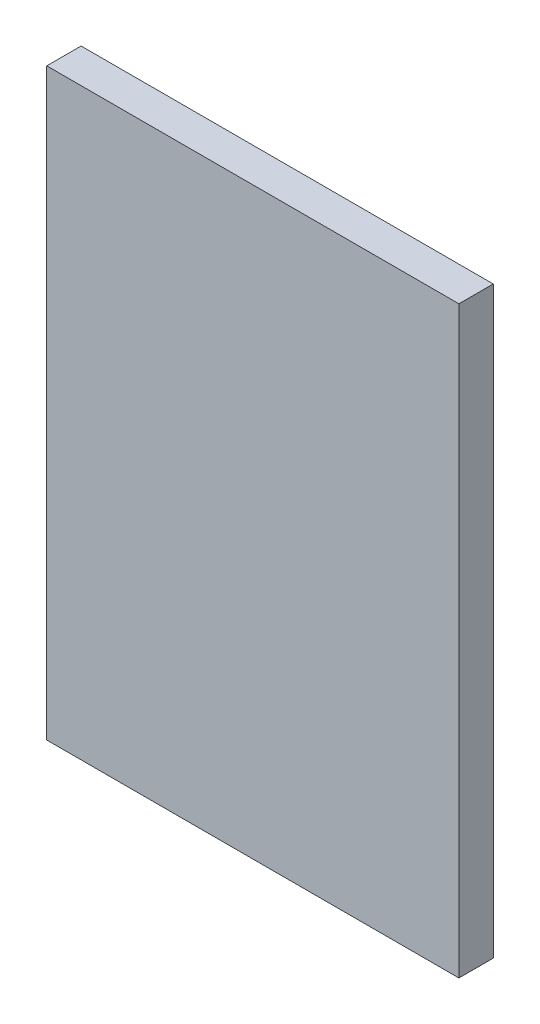
ISO-10303-21;
HEADER;
FILE_DESCRIPTION(('STEP AP214'),'2;1');
FILE_NAME('part.step','',(''),(''),'','','');
FILE_SCHEMA(('AUTOMOTIVE_DESIGN { 1 0 10303 214 1 1 1 1 }'));
ENDSEC;
DATA;
#1=APPLICATION_CONTEXT('core data for automotive mechanical design processes');
#2=APPLICATION_PROTOCOL_DEFINITION('international standard','automotive_design',2000,#1);
#3=PRODUCT_CONTEXT('',#1,'mechanical');
#4=PRODUCT('Part','Part','',(#3));
#5=PRODUCT_RELATED_PRODUCT_CATEGORY('part','',(#4));
#6=PRODUCT_DEFINITION_FORMATION('','',#4);
#7=PRODUCT_DEFINITION_CONTEXT('part definition',#1,'design');
#8=PRODUCT_DEFINITION('design','',#6,#7);
#9=PRODUCT_DEFINITION_SHAPE('','',#8);
#10=(LENGTH_UNIT() NAMED_UNIT(*) SI_UNIT(.MILLI.,.METRE.));
#11=(NAMED_UNIT(*) PLANE_ANGLE_UNIT() SI_UNIT($,.RADIAN.));
#12=(NAMED_UNIT(*) SI_UNIT($,.STERADIAN.) SOLID_ANGLE_UNIT());
#13=UNCERTAINTY_MEASURE_WITH_UNIT(LENGTH_MEASURE(1.E-05),#10,'distance_accuracy_value','');
#14=(GEOMETRIC_REPRESENTATION_CONTEXT(3) GLOBAL_UNCERTAINTY_ASSIGNED_CONTEXT((#13)) GLOBAL_UNIT_ASSIGNED_CONTEXT((#10,
#11,#12)) REPRESENTATION_CONTEXT('',''));
#15=CARTESIAN_POINT('',(0.,0.,0.));
#16=DIRECTION('',(0.,0.,1.));
#17=DIRECTION('',(1.,0.,0.));
#18=AXIS2_PLACEMENT_3D('',#15,#16,#17);
#19=CARTESIAN_POINT('',(152.4,-215.9,25.4));
#20=DIRECTION('',(-1.,0.,0.));
#21=DIRECTION('',(0.,0.,1.));
#22=AXIS2_PLACEMENT_3D('',#19,#20,#21);
#23=PLANE('',#22);
#24=DIRECTION('',(0.,1.,0.));
#25=VECTOR('',#24,1.);
#26=CARTESIAN_POINT('',(152.4,-215.9,0.));
#27=LINE('',#26,#25);
#28=CARTESIAN_POINT('',(152.4,-215.9,0.));
#29=VERTEX_POINT('',#28);
#30=CARTESIAN_POINT('',(152.4,215.9,0.));
#31=VERTEX_POINT('',#30);
#32=EDGE_CURVE('E96',#29,#31,#27,.T.);
#33=ORIENTED_EDGE('',*,*,#32,.T.);
#34=DIRECTION('',(0.,0.,-1.));
#35=VECTOR('',#34,1.);
#36=CARTESIAN_POINT('',(152.4,215.9,25.4));
#37=LINE('',#36,#35);
#38=CARTESIAN_POINT('',(152.4,215.9,25.4));
#39=VERTEX_POINT('',#38);
#40=EDGE_CURVE('E11',#39,#31,#37,.T.);
#41=ORIENTED_EDGE('',*,*,#40,.F.);
#42=DIRECTION('',(0.,1.,0.));
#43=VECTOR('',#42,1.);
#44=CARTESIAN_POINT('',(152.4,-215.9,25.4));
#45=LINE('',#44,#43);
#46=CARTESIAN_POINT('',(152.4,-215.9,25.4));
#47=VERTEX_POINT('',#46);
#48=EDGE_CURVE('E84',#47,#39,#45,.T.);
#49=ORIENTED_EDGE('',*,*,#48,.F.);
#50=DIRECTION('',(0.,0.,-1.));
#51=VECTOR('',#50,1.);
#52=CARTESIAN_POINT('',(152.4,-215.9,25.4));
#53=LINE('',#52,#51);
#54=EDGE_CURVE('E92',#47,#29,#53,.T.);
#55=ORIENTED_EDGE('',*,*,#54,.T.);
#56=EDGE_LOOP('',(#33,#41,#49,#55));
#57=FACE_BOUND('',#56,.T.);
#58=ADVANCED_FACE('F33',(#57),#23,.F.);
#59=CARTESIAN_POINT('',(-152.4,215.9,25.4));
#60=DIRECTION('',(0.,-1.,0.));
#61=DIRECTION('',(0.,0.,-1.));
#62=AXIS2_PLACEMENT_3D('',#59,#60,#61);
#63=PLANE('',#62);
#64=DIRECTION('',(-1.,0.,0.));
#65=VECTOR('',#64,1.);
#66=CARTESIAN_POINT('',(-152.4,215.9,0.));
#67=LINE('',#66,#65);
#68=CARTESIAN_POINT('',(-152.4,215.9,0.));
#69=VERTEX_POINT('',#68);
#70=EDGE_CURVE('E88',#31,#69,#67,.T.);
#71=ORIENTED_EDGE('',*,*,#70,.T.);
#72=DIRECTION('',(0.,0.,-1.));
#73=VECTOR('',#72,1.);
#74=CARTESIAN_POINT('',(-152.4,215.9,25.4));
#75=LINE('',#74,#73);
#76=CARTESIAN_POINT('',(-152.4,215.9,25.4));
#77=VERTEX_POINT('',#76);
#78=EDGE_CURVE('E41',#77,#69,#75,.T.);
#79=ORIENTED_EDGE('',*,*,#78,.F.);
#80=DIRECTION('',(-1.,0.,0.));
#81=VECTOR('',#80,1.);
#82=CARTESIAN_POINT('',(-152.4,215.9,25.4));
#83=LINE('',#82,#81);
#84=EDGE_CURVE('E79',#39,#77,#83,.T.);
#85=ORIENTED_EDGE('',*,*,#84,.F.);
#86=ORIENTED_EDGE('',*,*,#40,.T.);
#87=EDGE_LOOP('',(#71,#79,#85,#86));
#88=FACE_BOUND('',#87,.T.);
#89=ADVANCED_FACE('F87',(#88),#63,.F.);
#90=CARTESIAN_POINT('',(-152.4,-215.9,25.4));
#91=DIRECTION('',(1.,0.,0.));
#92=DIRECTION('',(0.,0.,-1.));
#93=AXIS2_PLACEMENT_3D('',#90,#91,#92);
#94=PLANE('',#93);
#95=DIRECTION('',(0.,-1.,0.));
#96=VECTOR('',#95,1.);
#97=CARTESIAN_POINT('',(-152.4,-215.9,0.));
#98=LINE('',#97,#96);
#99=CARTESIAN_POINT('',(-152.4,-215.9,0.));
#100=VERTEX_POINT('',#99);
#101=EDGE_CURVE('E66',#69,#100,#98,.T.);
#102=ORIENTED_EDGE('',*,*,#101,.T.);
#103=DIRECTION('',(0.,0.,-1.));
#104=VECTOR('',#103,1.);
#105=CARTESIAN_POINT('',(-152.4,-215.9,25.4));
#106=LINE('',#105,#104);
#107=CARTESIAN_POINT('',(-152.4,-215.9,25.4));
#108=VERTEX_POINT('',#107);
#109=EDGE_CURVE('E89',#108,#100,#106,.T.);
#110=ORIENTED_EDGE('',*,*,#109,.F.);
#111=DIRECTION('',(0.,-1.,0.));
#112=VECTOR('',#111,1.);
#113=CARTESIAN_POINT('',(-152.4,-215.9,25.4));
#114=LINE('',#113,#112);
#115=EDGE_CURVE('E82',#77,#108,#114,.T.);
#116=ORIENTED_EDGE('',*,*,#115,.F.);
#117=ORIENTED_EDGE('',*,*,#78,.T.);
#118=EDGE_LOOP('',(#102,#110,#116,#117));
#119=FACE_BOUND('',#118,.T.);
#120=ADVANCED_FACE('F90',(#119),#94,.F.);
#121=CARTESIAN_POINT('',(-152.4,-215.9,25.4));
#122=DIRECTION('',(0.,1.,0.));
#123=DIRECTION('',(0.,0.,1.));
#124=AXIS2_PLACEMENT_3D('',#121,#122,#123);
#125=PLANE('',#124);
#126=DIRECTION('',(1.,0.,0.));
#127=VECTOR('',#126,1.);
#128=CARTESIAN_POINT('',(-152.4,-215.9,0.));
#129=LINE('',#128,#127);
#130=EDGE_CURVE('E72',#100,#29,#129,.T.);
#131=ORIENTED_EDGE('',*,*,#130,.T.);
#132=ORIENTED_EDGE('',*,*,#54,.F.);
#133=DIRECTION('',(1.,0.,0.));
#134=VECTOR('',#133,1.);
#135=CARTESIAN_POINT('',(-152.4,-215.9,25.4));
#136=LINE('',#135,#134);
#137=EDGE_CURVE('E49',#108,#47,#136,.T.);
#138=ORIENTED_EDGE('',*,*,#137,.F.);
#139=ORIENTED_EDGE('',*,*,#109,.T.);
#140=EDGE_LOOP('',(#131,#132,#138,#139));
#141=FACE_BOUND('',#140,.T.);
#142=ADVANCED_FACE('F103',(#141),#125,.F.);
#143=CARTESIAN_POINT('',(0.,0.,25.4));
#144=DIRECTION('',(0.,0.,-1.));
#145=DIRECTION('',(-1.,0.,0.));
#146=AXIS2_PLACEMENT_3D('',#143,#144,#145);
#147=PLANE('',#146);
#148=ORIENTED_EDGE('',*,*,#48,.T.);
#149=ORIENTED_EDGE('',*,*,#84,.T.);
#150=ORIENTED_EDGE('',*,*,#115,.T.);
#151=ORIENTED_EDGE('',*,*,#137,.T.);
#152=EDGE_LOOP('',(#148,#149,#150,#151));
#153=FACE_BOUND('',#152,.T.);
#154=ADVANCED_FACE('F80',(#153),#147,.F.);
#155=CARTESIAN_POINT('',(0.,0.,0.));
#156=DIRECTION('',(0.,0.,-1.));
#157=DIRECTION('',(-1.,0.,0.));
#158=AXIS2_PLACEMENT_3D('',#155,#156,#157);
#159=PLANE('',#158);
#160=ORIENTED_EDGE('',*,*,#32,.F.);
#161=ORIENTED_EDGE('',*,*,#130,.F.);
#162=ORIENTED_EDGE('',*,*,#101,.F.);
#163=ORIENTED_EDGE('',*,*,#70,.F.);
#164=EDGE_LOOP('',(#160,#161,#162,#163));
#165=FACE_BOUND('',#164,.T.);
#166=ADVANCED_FACE('F106',(#165),#159,.T.);
#167=CLOSED_SHELL('',(#58,#89,#120,#142,#154,#166));
#168=MANIFOLD_SOLID_BREP('B2',#167);
#169=ADVANCED_BREP_SHAPE_REPRESENTATION('',(#18,#168),#14);
#170=SHAPE_DEFINITION_REPRESENTATION(#9,#169);
ENDSEC;
END-ISO-10303-21;
